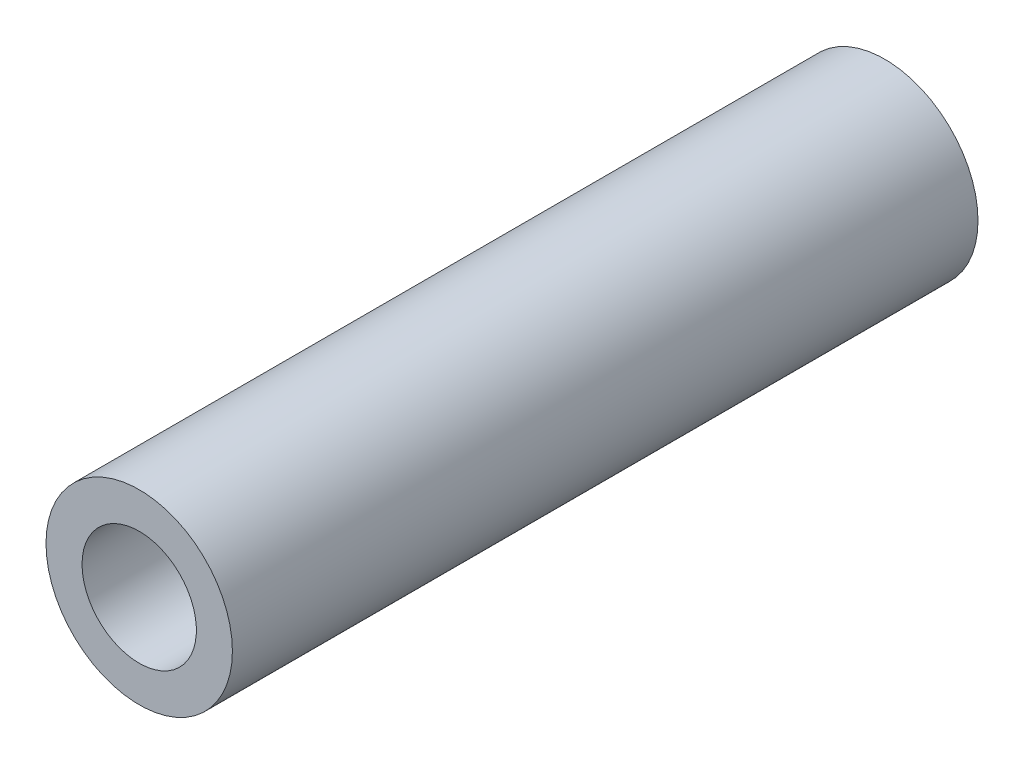
ISO-10303-21;
HEADER;
FILE_DESCRIPTION(('STEP AP214'),'2;1');
FILE_NAME('part.step','',(''),(''),'','','');
FILE_SCHEMA(('AUTOMOTIVE_DESIGN { 1 0 10303 214 1 1 1 1 }'));
ENDSEC;
DATA;
#1=APPLICATION_CONTEXT('core data for automotive mechanical design processes');
#2=APPLICATION_PROTOCOL_DEFINITION('international standard','automotive_design',2000,#1);
#3=PRODUCT_CONTEXT('',#1,'mechanical');
#4=PRODUCT('Part','Part','',(#3));
#5=PRODUCT_RELATED_PRODUCT_CATEGORY('part','',(#4));
#6=PRODUCT_DEFINITION_FORMATION('','',#4);
#7=PRODUCT_DEFINITION_CONTEXT('part definition',#1,'design');
#8=PRODUCT_DEFINITION('design','',#6,#7);
#9=PRODUCT_DEFINITION_SHAPE('','',#8);
#10=(LENGTH_UNIT() NAMED_UNIT(*) SI_UNIT(.MILLI.,.METRE.));
#11=(NAMED_UNIT(*) PLANE_ANGLE_UNIT() SI_UNIT($,.RADIAN.));
#12=(NAMED_UNIT(*) SI_UNIT($,.STERADIAN.) SOLID_ANGLE_UNIT());
#13=UNCERTAINTY_MEASURE_WITH_UNIT(LENGTH_MEASURE(1.E-05),#10,'distance_accuracy_value','');
#14=(GEOMETRIC_REPRESENTATION_CONTEXT(3) GLOBAL_UNCERTAINTY_ASSIGNED_CONTEXT((#13)) GLOBAL_UNIT_ASSIGNED_CONTEXT((#10,
#11,#12)) REPRESENTATION_CONTEXT('',''));
#15=CARTESIAN_POINT('',(0.,0.,0.));
#16=DIRECTION('',(0.,0.,1.));
#17=DIRECTION('',(1.,0.,0.));
#18=AXIS2_PLACEMENT_3D('',#15,#16,#17);
#19=CARTESIAN_POINT('',(0.,0.,9.525));
#20=DIRECTION('',(0.,0.,1.));
#21=DIRECTION('',(1.,0.,0.));
#22=AXIS2_PLACEMENT_3D('',#19,#20,#21);
#23=PLANE('',#22);
#24=CARTESIAN_POINT('',(0.,0.,9.525));
#25=DIRECTION('',(0.,0.,1.));
#26=DIRECTION('',(1.,0.,0.));
#27=AXIS2_PLACEMENT_3D('',#24,#25,#26);
#28=CIRCLE('',#27,2.38125);
#29=CARTESIAN_POINT('',(-2.38125,0.,9.525));
#30=VERTEX_POINT('',#29);
#31=EDGE_CURVE('E10',#30,#30,#28,.T.);
#32=ORIENTED_EDGE('',*,*,#31,.T.);
#33=EDGE_LOOP('',(#32));
#34=FACE_BOUND('',#33,.T.);
#35=CARTESIAN_POINT('',(0.,0.,9.525));
#36=DIRECTION('',(0.,0.,1.));
#37=DIRECTION('',(1.,0.,0.));
#38=AXIS2_PLACEMENT_3D('',#35,#36,#37);
#39=CIRCLE('',#38,1.4605);
#40=CARTESIAN_POINT('',(-1.4605,0.,9.525));
#41=VERTEX_POINT('',#40);
#42=EDGE_CURVE('E37',#41,#41,#39,.T.);
#43=ORIENTED_EDGE('',*,*,#42,.F.);
#44=EDGE_LOOP('',(#43));
#45=FACE_BOUND('',#44,.T.);
#46=ADVANCED_FACE('F30',(#34,#45),#23,.T.);
#47=CARTESIAN_POINT('',(0.,0.,9.525));
#48=DIRECTION('',(0.,0.,-1.));
#49=DIRECTION('',(-1.,0.,0.));
#50=AXIS2_PLACEMENT_3D('',#47,#48,#49);
#51=CYLINDRICAL_SURFACE('',#50,2.38125);
#52=CARTESIAN_POINT('',(0.,0.,-9.525));
#53=DIRECTION('',(0.,0.,1.));
#54=DIRECTION('',(1.,0.,0.));
#55=AXIS2_PLACEMENT_3D('',#52,#53,#54);
#56=CIRCLE('',#55,2.38125);
#57=CARTESIAN_POINT('',(-2.38125,0.,-9.525));
#58=VERTEX_POINT('',#57);
#59=EDGE_CURVE('E41',#58,#58,#56,.T.);
#60=CARTESIAN_POINT('',(-2.38125,0.,9.525));
#61=CARTESIAN_POINT('',(-2.38125,0.,9.3265625));
#62=CARTESIAN_POINT('',(-2.38125,0.,9.128125));
#63=CARTESIAN_POINT('',(-2.38125,0.,8.73125));
#64=CARTESIAN_POINT('',(-2.38125,0.,8.5328125));
#65=CARTESIAN_POINT('',(-2.38125,0.,8.1359375));
#66=CARTESIAN_POINT('',(-2.38125,0.,7.9375));
#67=CARTESIAN_POINT('',(-2.38125,0.,7.540625));
#68=CARTESIAN_POINT('',(-2.38125,0.,7.3421875));
#69=CARTESIAN_POINT('',(-2.38125,0.,6.9453125));
#70=CARTESIAN_POINT('',(-2.38125,0.,6.746875));
#71=CARTESIAN_POINT('',(-2.38125,0.,6.35));
#72=CARTESIAN_POINT('',(-2.38125,0.,6.1515625));
#73=CARTESIAN_POINT('',(-2.38125,0.,5.7546875));
#74=CARTESIAN_POINT('',(-2.38125,0.,5.55625));
#75=CARTESIAN_POINT('',(-2.38125,0.,5.159375));
#76=CARTESIAN_POINT('',(-2.38125,0.,4.9609375));
#77=CARTESIAN_POINT('',(-2.38125,0.,4.5640625));
#78=CARTESIAN_POINT('',(-2.38125,0.,4.365625));
#79=CARTESIAN_POINT('',(-2.38125,0.,3.96875));
#80=CARTESIAN_POINT('',(-2.38125,0.,3.7703125));
#81=CARTESIAN_POINT('',(-2.38125,0.,3.3734375));
#82=CARTESIAN_POINT('',(-2.38125,0.,3.175));
#83=CARTESIAN_POINT('',(-2.38125,0.,2.778125));
#84=CARTESIAN_POINT('',(-2.38125,0.,2.5796875));
#85=CARTESIAN_POINT('',(-2.38125,0.,2.1828125));
#86=CARTESIAN_POINT('',(-2.38125,0.,1.984375));
#87=CARTESIAN_POINT('',(-2.38125,0.,1.5875));
#88=CARTESIAN_POINT('',(-2.38125,0.,1.3890625));
#89=CARTESIAN_POINT('',(-2.38125,0.,0.992187500000001));
#90=CARTESIAN_POINT('',(-2.38125,0.,0.793750000000001));
#91=CARTESIAN_POINT('',(-2.38125,0.,0.396875));
#92=CARTESIAN_POINT('',(-2.38125,0.,0.1984375));
#93=CARTESIAN_POINT('',(-2.38125,0.,-0.1984375));
#94=CARTESIAN_POINT('',(-2.38125,0.,-0.396875));
#95=CARTESIAN_POINT('',(-2.38125,0.,-0.793750000000001));
#96=CARTESIAN_POINT('',(-2.38125,0.,-0.992187500000001));
#97=CARTESIAN_POINT('',(-2.38125,0.,-1.3890625));
#98=CARTESIAN_POINT('',(-2.38125,0.,-1.5875));
#99=CARTESIAN_POINT('',(-2.38125,0.,-1.984375));
#100=CARTESIAN_POINT('',(-2.38125,0.,-2.1828125));
#101=CARTESIAN_POINT('',(-2.38125,0.,-2.5796875));
#102=CARTESIAN_POINT('',(-2.38125,0.,-2.778125));
#103=CARTESIAN_POINT('',(-2.38125,0.,-3.175));
#104=CARTESIAN_POINT('',(-2.38125,0.,-3.3734375));
#105=CARTESIAN_POINT('',(-2.38125,0.,-3.7703125));
#106=CARTESIAN_POINT('',(-2.38125,0.,-3.96875));
#107=CARTESIAN_POINT('',(-2.38125,0.,-4.365625));
#108=CARTESIAN_POINT('',(-2.38125,0.,-4.5640625));
#109=CARTESIAN_POINT('',(-2.38125,0.,-4.9609375));
#110=CARTESIAN_POINT('',(-2.38125,0.,-5.159375));
#111=CARTESIAN_POINT('',(-2.38125,0.,-5.55625));
#112=CARTESIAN_POINT('',(-2.38125,0.,-5.7546875));
#113=CARTESIAN_POINT('',(-2.38125,0.,-6.1515625));
#114=CARTESIAN_POINT('',(-2.38125,0.,-6.35));
#115=CARTESIAN_POINT('',(-2.38125,0.,-6.746875));
#116=CARTESIAN_POINT('',(-2.38125,0.,-6.9453125));
#117=CARTESIAN_POINT('',(-2.38125,0.,-7.3421875));
#118=CARTESIAN_POINT('',(-2.38125,0.,-7.540625));
#119=CARTESIAN_POINT('',(-2.38125,0.,-7.9375));
#120=CARTESIAN_POINT('',(-2.38125,0.,-8.1359375));
#121=CARTESIAN_POINT('',(-2.38125,0.,-8.5328125));
#122=CARTESIAN_POINT('',(-2.38125,0.,-8.73125));
#123=CARTESIAN_POINT('',(-2.38125,0.,-9.128125));
#124=CARTESIAN_POINT('',(-2.38125,0.,-9.3265625));
#125=CARTESIAN_POINT('',(-2.38125,0.,-9.525));
#126=B_SPLINE_CURVE_WITH_KNOTS('',3,(#60,#61,#62,#63,#64,#65,#66,#67,#68,#69,#70,#71,#72,#73,
#74,#75,#76,#77,#78,#79,#80,#81,#82,#83,#84,#85,#86,#87,#88,#89,#90,#91,#92,#93,#94,#95,#96,#97,
#98,#99,#100,#101,#102,#103,#104,#105,#106,#107,#108,#109,#110,#111,#112,#113,#114,#115,#116,
#117,#118,#119,#120,#121,#122,#123,#124,#125),.UNSPECIFIED.,.F.,.F.,(4,2,2,2,2,2,2,2,2,2,2,2,2,
2,2,2,2,2,2,2,2,2,2,2,2,2,2,2,2,2,2,2,4),(0.,0.5953125,1.190625,1.7859375,2.38125,2.9765625,
3.571875,4.1671875,4.7625,5.3578125,5.953125,6.5484375,7.14375,7.7390625,8.334375,8.9296875,
9.525,10.1203125,10.715625,11.3109375,11.90625,12.5015625,13.096875,13.6921875,14.2875,
14.8828125,15.478125,16.0734375,16.66875,17.2640625,17.859375,18.4546875,19.05),.UNSPECIFIED.);
#127=EDGE_CURVE('BSEAM32',#30,#58,#126,.T.);
#128=ORIENTED_EDGE('',*,*,#31,.F.);
#129=ORIENTED_EDGE('',*,*,#59,.T.);
#130=ORIENTED_EDGE('',*,*,#127,.T.);
#131=ORIENTED_EDGE('',*,*,#127,.F.);
#132=EDGE_LOOP('',(#128,#130,#129,#131));
#133=FACE_BOUND('',#132,.T.);
#134=ADVANCED_FACE('F32',(#133),#51,.T.);
#135=CARTESIAN_POINT('',(0.,0.,9.525));
#136=DIRECTION('',(0.,0.,-1.));
#137=DIRECTION('',(-1.,0.,0.));
#138=AXIS2_PLACEMENT_3D('',#135,#136,#137);
#139=CYLINDRICAL_SURFACE('',#138,1.4605);
#140=CARTESIAN_POINT('',(0.,0.,-9.525));
#141=DIRECTION('',(0.,0.,1.));
#142=DIRECTION('',(1.,0.,0.));
#143=AXIS2_PLACEMENT_3D('',#140,#141,#142);
#144=CIRCLE('',#143,1.4605);
#145=CARTESIAN_POINT('',(-1.4605,0.,-9.525));
#146=VERTEX_POINT('',#145);
#147=EDGE_CURVE('E45',#146,#146,#144,.T.);
#148=CARTESIAN_POINT('',(-1.4605,0.,9.525));
#149=CARTESIAN_POINT('',(-1.4605,0.,9.3265625));
#150=CARTESIAN_POINT('',(-1.4605,0.,9.128125));
#151=CARTESIAN_POINT('',(-1.4605,0.,8.73125));
#152=CARTESIAN_POINT('',(-1.4605,0.,8.5328125));
#153=CARTESIAN_POINT('',(-1.4605,0.,8.1359375));
#154=CARTESIAN_POINT('',(-1.4605,0.,7.9375));
#155=CARTESIAN_POINT('',(-1.4605,0.,7.540625));
#156=CARTESIAN_POINT('',(-1.4605,0.,7.3421875));
#157=CARTESIAN_POINT('',(-1.4605,0.,6.9453125));
#158=CARTESIAN_POINT('',(-1.4605,0.,6.746875));
#159=CARTESIAN_POINT('',(-1.4605,0.,6.35));
#160=CARTESIAN_POINT('',(-1.4605,0.,6.1515625));
#161=CARTESIAN_POINT('',(-1.4605,0.,5.7546875));
#162=CARTESIAN_POINT('',(-1.4605,0.,5.55625));
#163=CARTESIAN_POINT('',(-1.4605,0.,5.159375));
#164=CARTESIAN_POINT('',(-1.4605,0.,4.9609375));
#165=CARTESIAN_POINT('',(-1.4605,0.,4.5640625));
#166=CARTESIAN_POINT('',(-1.4605,0.,4.365625));
#167=CARTESIAN_POINT('',(-1.4605,0.,3.96875));
#168=CARTESIAN_POINT('',(-1.4605,0.,3.7703125));
#169=CARTESIAN_POINT('',(-1.4605,0.,3.3734375));
#170=CARTESIAN_POINT('',(-1.4605,0.,3.175));
#171=CARTESIAN_POINT('',(-1.4605,0.,2.778125));
#172=CARTESIAN_POINT('',(-1.4605,0.,2.5796875));
#173=CARTESIAN_POINT('',(-1.4605,0.,2.1828125));
#174=CARTESIAN_POINT('',(-1.4605,0.,1.984375));
#175=CARTESIAN_POINT('',(-1.4605,0.,1.5875));
#176=CARTESIAN_POINT('',(-1.4605,0.,1.3890625));
#177=CARTESIAN_POINT('',(-1.4605,0.,0.992187500000001));
#178=CARTESIAN_POINT('',(-1.4605,0.,0.793750000000001));
#179=CARTESIAN_POINT('',(-1.4605,0.,0.396875));
#180=CARTESIAN_POINT('',(-1.4605,0.,0.1984375));
#181=CARTESIAN_POINT('',(-1.4605,0.,-0.1984375));
#182=CARTESIAN_POINT('',(-1.4605,0.,-0.396875));
#183=CARTESIAN_POINT('',(-1.4605,0.,-0.793750000000001));
#184=CARTESIAN_POINT('',(-1.4605,0.,-0.992187500000001));
#185=CARTESIAN_POINT('',(-1.4605,0.,-1.3890625));
#186=CARTESIAN_POINT('',(-1.4605,0.,-1.5875));
#187=CARTESIAN_POINT('',(-1.4605,0.,-1.984375));
#188=CARTESIAN_POINT('',(-1.4605,0.,-2.1828125));
#189=CARTESIAN_POINT('',(-1.4605,0.,-2.5796875));
#190=CARTESIAN_POINT('',(-1.4605,0.,-2.778125));
#191=CARTESIAN_POINT('',(-1.4605,0.,-3.175));
#192=CARTESIAN_POINT('',(-1.4605,0.,-3.3734375));
#193=CARTESIAN_POINT('',(-1.4605,0.,-3.7703125));
#194=CARTESIAN_POINT('',(-1.4605,0.,-3.96875));
#195=CARTESIAN_POINT('',(-1.4605,0.,-4.365625));
#196=CARTESIAN_POINT('',(-1.4605,0.,-4.5640625));
#197=CARTESIAN_POINT('',(-1.4605,0.,-4.9609375));
#198=CARTESIAN_POINT('',(-1.4605,0.,-5.159375));
#199=CARTESIAN_POINT('',(-1.4605,0.,-5.55625));
#200=CARTESIAN_POINT('',(-1.4605,0.,-5.7546875));
#201=CARTESIAN_POINT('',(-1.4605,0.,-6.1515625));
#202=CARTESIAN_POINT('',(-1.4605,0.,-6.35));
#203=CARTESIAN_POINT('',(-1.4605,0.,-6.746875));
#204=CARTESIAN_POINT('',(-1.4605,0.,-6.9453125));
#205=CARTESIAN_POINT('',(-1.4605,0.,-7.3421875));
#206=CARTESIAN_POINT('',(-1.4605,0.,-7.540625));
#207=CARTESIAN_POINT('',(-1.4605,0.,-7.9375));
#208=CARTESIAN_POINT('',(-1.4605,0.,-8.1359375));
#209=CARTESIAN_POINT('',(-1.4605,0.,-8.5328125));
#210=CARTESIAN_POINT('',(-1.4605,0.,-8.73125));
#211=CARTESIAN_POINT('',(-1.4605,0.,-9.128125));
#212=CARTESIAN_POINT('',(-1.4605,0.,-9.3265625));
#213=CARTESIAN_POINT('',(-1.4605,0.,-9.525));
#214=B_SPLINE_CURVE_WITH_KNOTS('',3,(#148,#149,#150,#151,#152,#153,#154,#155,#156,#157,#158,
#159,#160,#161,#162,#163,#164,#165,#166,#167,#168,#169,#170,#171,#172,#173,#174,#175,#176,#177,
#178,#179,#180,#181,#182,#183,#184,#185,#186,#187,#188,#189,#190,#191,#192,#193,#194,#195,#196,
#197,#198,#199,#200,#201,#202,#203,#204,#205,#206,#207,#208,#209,#210,#211,#212,#213),
.UNSPECIFIED.,.F.,.F.,(4,2,2,2,2,2,2,2,2,2,2,2,2,2,2,2,2,2,2,2,2,2,2,2,2,2,2,2,2,2,2,2,4),(0.,
0.5953125,1.190625,1.7859375,2.38125,2.9765625,3.571875,4.1671875,4.7625,5.3578125,5.953125,
6.5484375,7.14375,7.7390625,8.334375,8.9296875,9.525,10.1203125,10.715625,11.3109375,11.90625,
12.5015625,13.096875,13.6921875,14.2875,14.8828125,15.478125,16.0734375,16.66875,17.2640625,
17.859375,18.4546875,19.05),.UNSPECIFIED.);
#215=EDGE_CURVE('BSEAM54',#41,#146,#214,.T.);
#216=ORIENTED_EDGE('',*,*,#42,.T.);
#217=ORIENTED_EDGE('',*,*,#147,.F.);
#218=ORIENTED_EDGE('',*,*,#215,.T.);
#219=ORIENTED_EDGE('',*,*,#215,.F.);
#220=EDGE_LOOP('',(#216,#218,#217,#219));
#221=FACE_BOUND('',#220,.T.);
#222=ADVANCED_FACE('F54',(#221),#139,.F.);
#223=CARTESIAN_POINT('',(0.,0.,-9.525));
#224=DIRECTION('',(0.,0.,1.));
#225=DIRECTION('',(1.,0.,0.));
#226=AXIS2_PLACEMENT_3D('',#223,#224,#225);
#227=PLANE('',#226);
#228=ORIENTED_EDGE('',*,*,#147,.T.);
#229=EDGE_LOOP('',(#228));
#230=FACE_BOUND('',#229,.T.);
#231=ORIENTED_EDGE('',*,*,#59,.F.);
#232=EDGE_LOOP('',(#231));
#233=FACE_BOUND('',#232,.T.);
#234=ADVANCED_FACE('F51',(#230,#233),#227,.F.);
#235=CLOSED_SHELL('',(#46,#134,#222,#234));
#236=MANIFOLD_SOLID_BREP('B2',#235);
#237=ADVANCED_BREP_SHAPE_REPRESENTATION('',(#18,#236),#14);
#238=SHAPE_DEFINITION_REPRESENTATION(#9,#237);
ENDSEC;
END-ISO-10303-21;
